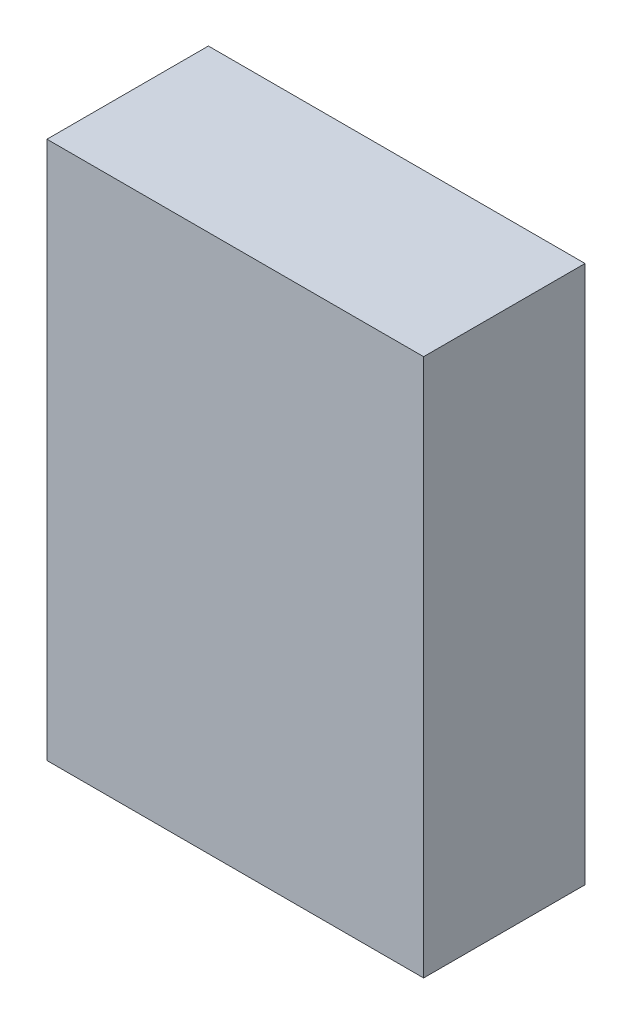
ISO-10303-21;
HEADER;
FILE_DESCRIPTION(('STEP AP214'),'2;1');
FILE_NAME('part.step','',(''),(''),'','','');
FILE_SCHEMA(('AUTOMOTIVE_DESIGN { 1 0 10303 214 1 1 1 1 }'));
ENDSEC;
DATA;
#1=APPLICATION_CONTEXT('core data for automotive mechanical design processes');
#2=APPLICATION_PROTOCOL_DEFINITION('international standard','automotive_design',2000,#1);
#3=PRODUCT_CONTEXT('',#1,'mechanical');
#4=PRODUCT('Part','Part','',(#3));
#5=PRODUCT_RELATED_PRODUCT_CATEGORY('part','',(#4));
#6=PRODUCT_DEFINITION_FORMATION('','',#4);
#7=PRODUCT_DEFINITION_CONTEXT('part definition',#1,'design');
#8=PRODUCT_DEFINITION('design','',#6,#7);
#9=PRODUCT_DEFINITION_SHAPE('','',#8);
#10=(LENGTH_UNIT() NAMED_UNIT(*) SI_UNIT(.MILLI.,.METRE.));
#11=(NAMED_UNIT(*) PLANE_ANGLE_UNIT() SI_UNIT($,.RADIAN.));
#12=(NAMED_UNIT(*) SI_UNIT($,.STERADIAN.) SOLID_ANGLE_UNIT());
#13=UNCERTAINTY_MEASURE_WITH_UNIT(LENGTH_MEASURE(1.E-05),#10,'distance_accuracy_value','');
#14=(GEOMETRIC_REPRESENTATION_CONTEXT(3) GLOBAL_UNCERTAINTY_ASSIGNED_CONTEXT((#13)) GLOBAL_UNIT_ASSIGNED_CONTEXT((#10,
#11,#12)) REPRESENTATION_CONTEXT('',''));
#15=CARTESIAN_POINT('',(0.,0.,0.));
#16=DIRECTION('',(0.,0.,1.));
#17=DIRECTION('',(1.,0.,0.));
#18=AXIS2_PLACEMENT_3D('',#15,#16,#17);
#19=CARTESIAN_POINT('',(0.,0.,12.));
#20=DIRECTION('',(0.,0.,1.));
#21=DIRECTION('',(1.,0.,0.));
#22=AXIS2_PLACEMENT_3D('',#19,#20,#21);
#23=PLANE('',#22);
#24=DIRECTION('',(0.,1.,0.));
#25=VECTOR('',#24,1.);
#26=CARTESIAN_POINT('',(0.,0.,12.));
#27=LINE('',#26,#25);
#28=CARTESIAN_POINT('',(0.,0.,12.));
#29=VERTEX_POINT('',#28);
#30=CARTESIAN_POINT('',(0.,40.,12.));
#31=VERTEX_POINT('',#30);
#32=EDGE_CURVE('E110',#29,#31,#27,.T.);
#33=ORIENTED_EDGE('',*,*,#32,.F.);
#34=DIRECTION('',(1.,0.,0.));
#35=VECTOR('',#34,1.);
#36=CARTESIAN_POINT('',(0.,0.,12.));
#37=LINE('',#36,#35);
#38=CARTESIAN_POINT('',(28.,0.,12.));
#39=VERTEX_POINT('',#38);
#40=EDGE_CURVE('E82',#29,#39,#37,.T.);
#41=ORIENTED_EDGE('',*,*,#40,.T.);
#42=DIRECTION('',(0.,1.,0.));
#43=VECTOR('',#42,1.);
#44=CARTESIAN_POINT('',(28.,0.,12.));
#45=LINE('',#44,#43);
#46=CARTESIAN_POINT('',(28.,40.,12.));
#47=VERTEX_POINT('',#46);
#48=EDGE_CURVE('E94',#39,#47,#45,.T.);
#49=ORIENTED_EDGE('',*,*,#48,.T.);
#50=DIRECTION('',(1.,0.,0.));
#51=VECTOR('',#50,1.);
#52=CARTESIAN_POINT('',(0.,40.,12.));
#53=LINE('',#52,#51);
#54=EDGE_CURVE('E10',#31,#47,#53,.T.);
#55=ORIENTED_EDGE('',*,*,#54,.F.);
#56=EDGE_LOOP('',(#33,#41,#49,#55));
#57=FACE_BOUND('',#56,.T.);
#58=ADVANCED_FACE('F15',(#57),#23,.T.);
#59=CARTESIAN_POINT('',(0.,0.,0.));
#60=DIRECTION('',(0.,0.,1.));
#61=DIRECTION('',(1.,0.,0.));
#62=AXIS2_PLACEMENT_3D('',#59,#60,#61);
#63=PLANE('',#62);
#64=DIRECTION('',(1.,0.,0.));
#65=VECTOR('',#64,1.);
#66=CARTESIAN_POINT('',(0.,40.,0.));
#67=LINE('',#66,#65);
#68=CARTESIAN_POINT('',(0.,40.,0.));
#69=VERTEX_POINT('',#68);
#70=CARTESIAN_POINT('',(28.,40.,0.));
#71=VERTEX_POINT('',#70);
#72=EDGE_CURVE('E25',#69,#71,#67,.T.);
#73=ORIENTED_EDGE('',*,*,#72,.T.);
#74=DIRECTION('',(0.,1.,0.));
#75=VECTOR('',#74,1.);
#76=CARTESIAN_POINT('',(28.,0.,0.));
#77=LINE('',#76,#75);
#78=CARTESIAN_POINT('',(28.,0.,0.));
#79=VERTEX_POINT('',#78);
#80=EDGE_CURVE('E85',#79,#71,#77,.T.);
#81=ORIENTED_EDGE('',*,*,#80,.F.);
#82=DIRECTION('',(1.,0.,0.));
#83=VECTOR('',#82,1.);
#84=CARTESIAN_POINT('',(0.,0.,0.));
#85=LINE('',#84,#83);
#86=CARTESIAN_POINT('',(0.,0.,0.));
#87=VERTEX_POINT('',#86);
#88=EDGE_CURVE('E70',#87,#79,#85,.T.);
#89=ORIENTED_EDGE('',*,*,#88,.F.);
#90=DIRECTION('',(0.,1.,0.));
#91=VECTOR('',#90,1.);
#92=CARTESIAN_POINT('',(0.,0.,0.));
#93=LINE('',#92,#91);
#94=EDGE_CURVE('E100',#87,#69,#93,.T.);
#95=ORIENTED_EDGE('',*,*,#94,.T.);
#96=EDGE_LOOP('',(#73,#81,#89,#95));
#97=FACE_BOUND('',#96,.T.);
#98=ADVANCED_FACE('F86',(#97),#63,.F.);
#99=CARTESIAN_POINT('',(0.,40.,0.));
#100=DIRECTION('',(0.,1.,0.));
#101=DIRECTION('',(1.,0.,0.));
#102=AXIS2_PLACEMENT_3D('',#99,#100,#101);
#103=PLANE('',#102);
#104=ORIENTED_EDGE('',*,*,#72,.F.);
#105=DIRECTION('',(0.,0.,1.));
#106=VECTOR('',#105,1.);
#107=CARTESIAN_POINT('',(0.,40.,0.));
#108=LINE('',#107,#106);
#109=EDGE_CURVE('E18',#69,#31,#108,.T.);
#110=ORIENTED_EDGE('',*,*,#109,.T.);
#111=ORIENTED_EDGE('',*,*,#54,.T.);
#112=DIRECTION('',(0.,0.,1.));
#113=VECTOR('',#112,1.);
#114=CARTESIAN_POINT('',(28.,40.,0.));
#115=LINE('',#114,#113);
#116=EDGE_CURVE('E90',#71,#47,#115,.T.);
#117=ORIENTED_EDGE('',*,*,#116,.F.);
#118=EDGE_LOOP('',(#104,#110,#111,#117));
#119=FACE_BOUND('',#118,.T.);
#120=ADVANCED_FACE('F116',(#119),#103,.T.);
#121=CARTESIAN_POINT('',(0.,0.,0.));
#122=DIRECTION('',(0.,1.,0.));
#123=DIRECTION('',(1.,0.,0.));
#124=AXIS2_PLACEMENT_3D('',#121,#122,#123);
#125=PLANE('',#124);
#126=DIRECTION('',(0.,0.,1.));
#127=VECTOR('',#126,1.);
#128=CARTESIAN_POINT('',(28.,0.,0.));
#129=LINE('',#128,#127);
#130=EDGE_CURVE('E77',#79,#39,#129,.T.);
#131=ORIENTED_EDGE('',*,*,#130,.T.);
#132=ORIENTED_EDGE('',*,*,#40,.F.);
#133=DIRECTION('',(0.,0.,1.));
#134=VECTOR('',#133,1.);
#135=CARTESIAN_POINT('',(0.,0.,0.));
#136=LINE('',#135,#134);
#137=EDGE_CURVE('E79',#87,#29,#136,.T.);
#138=ORIENTED_EDGE('',*,*,#137,.F.);
#139=ORIENTED_EDGE('',*,*,#88,.T.);
#140=EDGE_LOOP('',(#131,#132,#138,#139));
#141=FACE_BOUND('',#140,.T.);
#142=ADVANCED_FACE('F75',(#141),#125,.F.);
#143=CARTESIAN_POINT('',(28.,0.,0.));
#144=DIRECTION('',(1.,0.,0.));
#145=DIRECTION('',(0.,1.,0.));
#146=AXIS2_PLACEMENT_3D('',#143,#144,#145);
#147=PLANE('',#146);
#148=ORIENTED_EDGE('',*,*,#130,.F.);
#149=ORIENTED_EDGE('',*,*,#80,.T.);
#150=ORIENTED_EDGE('',*,*,#116,.T.);
#151=ORIENTED_EDGE('',*,*,#48,.F.);
#152=EDGE_LOOP('',(#148,#149,#150,#151));
#153=FACE_BOUND('',#152,.T.);
#154=ADVANCED_FACE('F93',(#153),#147,.T.);
#155=CARTESIAN_POINT('',(0.,0.,0.));
#156=DIRECTION('',(1.,0.,0.));
#157=DIRECTION('',(0.,1.,0.));
#158=AXIS2_PLACEMENT_3D('',#155,#156,#157);
#159=PLANE('',#158);
#160=ORIENTED_EDGE('',*,*,#32,.T.);
#161=ORIENTED_EDGE('',*,*,#109,.F.);
#162=ORIENTED_EDGE('',*,*,#94,.F.);
#163=ORIENTED_EDGE('',*,*,#137,.T.);
#164=EDGE_LOOP('',(#160,#161,#162,#163));
#165=FACE_BOUND('',#164,.T.);
#166=ADVANCED_FACE('F131',(#165),#159,.F.);
#167=CLOSED_SHELL('',(#58,#98,#120,#142,#154,#166));
#168=MANIFOLD_SOLID_BREP('B1',#167);
#169=ADVANCED_BREP_SHAPE_REPRESENTATION('',(#18,#168),#14);
#170=SHAPE_DEFINITION_REPRESENTATION(#9,#169);
ENDSEC;
END-ISO-10303-21;
